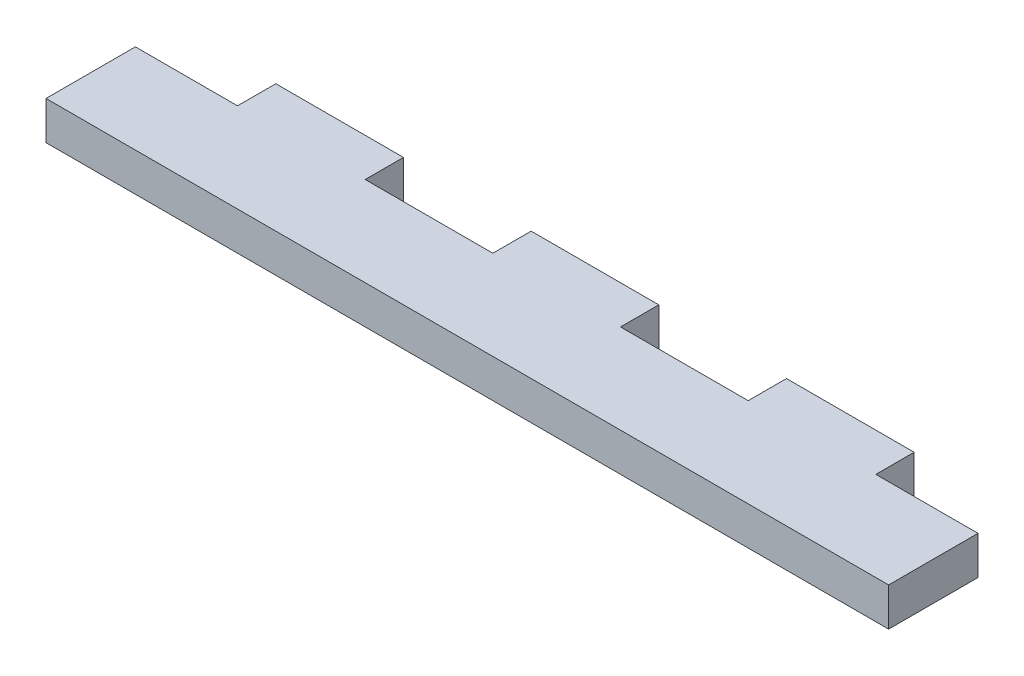
ISO-10303-21;
HEADER;
FILE_DESCRIPTION(('STEP AP214'),'2;1');
FILE_NAME('part.step','',(''),(''),'','','');
FILE_SCHEMA(('AUTOMOTIVE_DESIGN { 1 0 10303 214 1 1 1 1 }'));
ENDSEC;
DATA;
#1=APPLICATION_CONTEXT('core data for automotive mechanical design processes');
#2=APPLICATION_PROTOCOL_DEFINITION('international standard','automotive_design',2000,#1);
#3=PRODUCT_CONTEXT('',#1,'mechanical');
#4=PRODUCT('Part','Part','',(#3));
#5=PRODUCT_RELATED_PRODUCT_CATEGORY('part','',(#4));
#6=PRODUCT_DEFINITION_FORMATION('','',#4);
#7=PRODUCT_DEFINITION_CONTEXT('part definition',#1,'design');
#8=PRODUCT_DEFINITION('design','',#6,#7);
#9=PRODUCT_DEFINITION_SHAPE('','',#8);
#10=(LENGTH_UNIT() NAMED_UNIT(*) SI_UNIT(.MILLI.,.METRE.));
#11=(NAMED_UNIT(*) PLANE_ANGLE_UNIT() SI_UNIT($,.RADIAN.));
#12=(NAMED_UNIT(*) SI_UNIT($,.STERADIAN.) SOLID_ANGLE_UNIT());
#13=UNCERTAINTY_MEASURE_WITH_UNIT(LENGTH_MEASURE(1.E-05),#10,'distance_accuracy_value','');
#14=(GEOMETRIC_REPRESENTATION_CONTEXT(3) GLOBAL_UNCERTAINTY_ASSIGNED_CONTEXT((#13)) GLOBAL_UNIT_ASSIGNED_CONTEXT((#10,
#11,#12)) REPRESENTATION_CONTEXT('',''));
#15=CARTESIAN_POINT('',(0.,0.,0.));
#16=DIRECTION('',(0.,0.,1.));
#17=DIRECTION('',(1.,0.,0.));
#18=AXIS2_PLACEMENT_3D('',#15,#16,#17);
#19=CARTESIAN_POINT('',(-33.,3.,-5.));
#20=DIRECTION('',(0.,0.,1.));
#21=DIRECTION('',(1.,0.,0.));
#22=AXIS2_PLACEMENT_3D('',#19,#20,#21);
#23=PLANE('',#22);
#24=DIRECTION('',(-1.,0.,0.));
#25=VECTOR('',#24,1.);
#26=CARTESIAN_POINT('',(-33.,0.,-5.));
#27=LINE('',#26,#25);
#28=CARTESIAN_POINT('',(-15.,0.,-4.99999999999999));
#29=VERTEX_POINT('',#28);
#30=CARTESIAN_POINT('',(-25.,0.,-5.));
#31=VERTEX_POINT('',#30);
#32=EDGE_CURVE('E185',#29,#31,#27,.T.);
#33=ORIENTED_EDGE('',*,*,#32,.T.);
#34=DIRECTION('',(0.,1.,0.));
#35=VECTOR('',#34,1.);
#36=CARTESIAN_POINT('',(-25.,0.,-5.));
#37=LINE('',#36,#35);
#38=CARTESIAN_POINT('',(-25.,3.,-5.));
#39=VERTEX_POINT('',#38);
#40=EDGE_CURVE('E205',#31,#39,#37,.T.);
#41=ORIENTED_EDGE('',*,*,#40,.T.);
#42=DIRECTION('',(-1.,0.,0.));
#43=VECTOR('',#42,1.);
#44=CARTESIAN_POINT('',(-33.,3.,-5.));
#45=LINE('',#44,#43);
#46=CARTESIAN_POINT('',(-15.,3.,-4.99999999999999));
#47=VERTEX_POINT('',#46);
#48=EDGE_CURVE('E316',#47,#39,#45,.T.);
#49=ORIENTED_EDGE('',*,*,#48,.F.);
#50=DIRECTION('',(0.,1.,0.));
#51=VECTOR('',#50,1.);
#52=CARTESIAN_POINT('',(-15.,0.,-4.99999999999999));
#53=LINE('',#52,#51);
#54=EDGE_CURVE('E243',#29,#47,#53,.T.);
#55=ORIENTED_EDGE('',*,*,#54,.F.);
#56=EDGE_LOOP('',(#33,#41,#49,#55));
#57=FACE_BOUND('',#56,.T.);
#58=ADVANCED_FACE('F38',(#57),#23,.F.);
#59=CARTESIAN_POINT('',(25.,0.,-5.));
#60=VERTEX_POINT('',#59);
#61=CARTESIAN_POINT('',(15.,0.,-4.99999999999999));
#62=VERTEX_POINT('',#61);
#63=EDGE_CURVE('E176',#60,#62,#27,.T.);
#64=ORIENTED_EDGE('',*,*,#63,.T.);
#65=DIRECTION('',(0.,1.,0.));
#66=VECTOR('',#65,1.);
#67=CARTESIAN_POINT('',(15.,0.,-4.99999999999999));
#68=LINE('',#67,#66);
#69=CARTESIAN_POINT('',(15.,3.,-4.99999999999999));
#70=VERTEX_POINT('',#69);
#71=EDGE_CURVE('E237',#62,#70,#68,.T.);
#72=ORIENTED_EDGE('',*,*,#71,.T.);
#73=CARTESIAN_POINT('',(25.,3.,-5.));
#74=VERTEX_POINT('',#73);
#75=EDGE_CURVE('E200',#74,#70,#45,.T.);
#76=ORIENTED_EDGE('',*,*,#75,.F.);
#77=DIRECTION('',(0.,1.,0.));
#78=VECTOR('',#77,1.);
#79=CARTESIAN_POINT('',(25.,0.,-5.));
#80=LINE('',#79,#78);
#81=EDGE_CURVE('E301',#60,#74,#80,.T.);
#82=ORIENTED_EDGE('',*,*,#81,.F.);
#83=EDGE_LOOP('',(#64,#72,#76,#82));
#84=FACE_BOUND('',#83,.T.);
#85=ADVANCED_FACE('F333',(#84),#23,.F.);
#86=CARTESIAN_POINT('',(33.,3.,-5.));
#87=DIRECTION('',(-1.,0.,0.));
#88=DIRECTION('',(0.,0.,1.));
#89=AXIS2_PLACEMENT_3D('',#86,#87,#88);
#90=PLANE('',#89);
#91=DIRECTION('',(0.,0.,-1.));
#92=VECTOR('',#91,1.);
#93=CARTESIAN_POINT('',(33.,0.,-5.));
#94=LINE('',#93,#92);
#95=CARTESIAN_POINT('',(33.,0.,5.));
#96=VERTEX_POINT('',#95);
#97=CARTESIAN_POINT('',(33.,0.,-2.));
#98=VERTEX_POINT('',#97);
#99=EDGE_CURVE('E203',#96,#98,#94,.T.);
#100=ORIENTED_EDGE('',*,*,#99,.T.);
#101=DIRECTION('',(0.,1.,0.));
#102=VECTOR('',#101,1.);
#103=CARTESIAN_POINT('',(33.,0.,-2.));
#104=LINE('',#103,#102);
#105=CARTESIAN_POINT('',(33.,3.,-2.));
#106=VERTEX_POINT('',#105);
#107=EDGE_CURVE('E275',#98,#106,#104,.T.);
#108=ORIENTED_EDGE('',*,*,#107,.T.);
#109=DIRECTION('',(0.,0.,-1.));
#110=VECTOR('',#109,1.);
#111=CARTESIAN_POINT('',(33.,3.,-5.));
#112=LINE('',#111,#110);
#113=CARTESIAN_POINT('',(33.,3.,5.));
#114=VERTEX_POINT('',#113);
#115=EDGE_CURVE('E180',#114,#106,#112,.T.);
#116=ORIENTED_EDGE('',*,*,#115,.F.);
#117=DIRECTION('',(0.,-1.,0.));
#118=VECTOR('',#117,1.);
#119=CARTESIAN_POINT('',(33.,3.,5.));
#120=LINE('',#119,#118);
#121=EDGE_CURVE('E47',#114,#96,#120,.T.);
#122=ORIENTED_EDGE('',*,*,#121,.T.);
#123=EDGE_LOOP('',(#100,#108,#116,#122));
#124=FACE_BOUND('',#123,.T.);
#125=ADVANCED_FACE('F40',(#124),#90,.F.);
#126=CARTESIAN_POINT('',(5.00000000000002,0.,-4.99999999999999));
#127=VERTEX_POINT('',#126);
#128=CARTESIAN_POINT('',(-5.00000000000002,0.,-4.99999999999999));
#129=VERTEX_POINT('',#128);
#130=EDGE_CURVE('E183',#127,#129,#27,.T.);
#131=ORIENTED_EDGE('',*,*,#130,.T.);
#132=DIRECTION('',(0.,1.,0.));
#133=VECTOR('',#132,1.);
#134=CARTESIAN_POINT('',(-5.00000000000002,0.,-4.99999999999999));
#135=LINE('',#134,#133);
#136=CARTESIAN_POINT('',(-5.00000000000002,3.,-4.99999999999999));
#137=VERTEX_POINT('',#136);
#138=EDGE_CURVE('E247',#129,#137,#135,.T.);
#139=ORIENTED_EDGE('',*,*,#138,.T.);
#140=CARTESIAN_POINT('',(5.00000000000002,3.,-4.99999999999999));
#141=VERTEX_POINT('',#140);
#142=EDGE_CURVE('E318',#141,#137,#45,.T.);
#143=ORIENTED_EDGE('',*,*,#142,.F.);
#144=DIRECTION('',(0.,1.,0.));
#145=VECTOR('',#144,1.);
#146=CARTESIAN_POINT('',(5.00000000000002,0.,-4.99999999999999));
#147=LINE('',#146,#145);
#148=EDGE_CURVE('E269',#127,#141,#147,.T.);
#149=ORIENTED_EDGE('',*,*,#148,.F.);
#150=EDGE_LOOP('',(#131,#139,#143,#149));
#151=FACE_BOUND('',#150,.T.);
#152=ADVANCED_FACE('F350',(#151),#23,.F.);
#153=CARTESIAN_POINT('',(-33.,3.,-5.));
#154=DIRECTION('',(1.,0.,0.));
#155=DIRECTION('',(0.,0.,-1.));
#156=AXIS2_PLACEMENT_3D('',#153,#154,#155);
#157=PLANE('',#156);
#158=DIRECTION('',(0.,0.,1.));
#159=VECTOR('',#158,1.);
#160=CARTESIAN_POINT('',(-33.,3.,-5.));
#161=LINE('',#160,#159);
#162=CARTESIAN_POINT('',(-33.,3.,-2.));
#163=VERTEX_POINT('',#162);
#164=CARTESIAN_POINT('',(-33.,3.,5.));
#165=VERTEX_POINT('',#164);
#166=EDGE_CURVE('E168',#163,#165,#161,.T.);
#167=ORIENTED_EDGE('',*,*,#166,.F.);
#168=DIRECTION('',(0.,1.,0.));
#169=VECTOR('',#168,1.);
#170=CARTESIAN_POINT('',(-33.,0.,-2.));
#171=LINE('',#170,#169);
#172=CARTESIAN_POINT('',(-33.,0.,-2.));
#173=VERTEX_POINT('',#172);
#174=EDGE_CURVE('E155',#173,#163,#171,.T.);
#175=ORIENTED_EDGE('',*,*,#174,.F.);
#176=DIRECTION('',(0.,0.,1.));
#177=VECTOR('',#176,1.);
#178=CARTESIAN_POINT('',(-33.,0.,-5.));
#179=LINE('',#178,#177);
#180=CARTESIAN_POINT('',(-33.,0.,5.));
#181=VERTEX_POINT('',#180);
#182=EDGE_CURVE('E167',#173,#181,#179,.T.);
#183=ORIENTED_EDGE('',*,*,#182,.T.);
#184=DIRECTION('',(0.,-1.,0.));
#185=VECTOR('',#184,1.);
#186=CARTESIAN_POINT('',(-33.,3.,5.));
#187=LINE('',#186,#185);
#188=EDGE_CURVE('E11',#165,#181,#187,.T.);
#189=ORIENTED_EDGE('',*,*,#188,.F.);
#190=EDGE_LOOP('',(#167,#175,#183,#189));
#191=FACE_BOUND('',#190,.T.);
#192=ADVANCED_FACE('F165',(#191),#157,.F.);
#193=CARTESIAN_POINT('',(-33.,3.,5.));
#194=DIRECTION('',(0.,0.,-1.));
#195=DIRECTION('',(-1.,0.,0.));
#196=AXIS2_PLACEMENT_3D('',#193,#194,#195);
#197=PLANE('',#196);
#198=DIRECTION('',(1.,0.,0.));
#199=VECTOR('',#198,1.);
#200=CARTESIAN_POINT('',(-33.,0.,5.));
#201=LINE('',#200,#199);
#202=EDGE_CURVE('E174',#181,#96,#201,.T.);
#203=ORIENTED_EDGE('',*,*,#202,.T.);
#204=ORIENTED_EDGE('',*,*,#121,.F.);
#205=DIRECTION('',(1.,0.,0.));
#206=VECTOR('',#205,1.);
#207=CARTESIAN_POINT('',(-33.,3.,5.));
#208=LINE('',#207,#206);
#209=EDGE_CURVE('E189',#165,#114,#208,.T.);
#210=ORIENTED_EDGE('',*,*,#209,.F.);
#211=ORIENTED_EDGE('',*,*,#188,.T.);
#212=EDGE_LOOP('',(#203,#204,#210,#211));
#213=FACE_BOUND('',#212,.T.);
#214=ADVANCED_FACE('F365',(#213),#197,.F.);
#215=CARTESIAN_POINT('',(0.,3.,0.));
#216=DIRECTION('',(0.,1.,0.));
#217=DIRECTION('',(0.,0.,1.));
#218=AXIS2_PLACEMENT_3D('',#215,#216,#217);
#219=PLANE('',#218);
#220=DIRECTION('',(0.,0.,-1.));
#221=VECTOR('',#220,1.);
#222=CARTESIAN_POINT('',(-25.,3.,-5.));
#223=LINE('',#222,#221);
#224=CARTESIAN_POINT('',(-25.,3.,-2.));
#225=VERTEX_POINT('',#224);
#226=EDGE_CURVE('E161',#225,#39,#223,.T.);
#227=ORIENTED_EDGE('',*,*,#226,.F.);
#228=DIRECTION('',(1.,0.,0.));
#229=VECTOR('',#228,1.);
#230=CARTESIAN_POINT('',(-33.,3.,-2.));
#231=LINE('',#230,#229);
#232=EDGE_CURVE('E246',#163,#225,#231,.T.);
#233=ORIENTED_EDGE('',*,*,#232,.F.);
#234=ORIENTED_EDGE('',*,*,#166,.T.);
#235=ORIENTED_EDGE('',*,*,#209,.T.);
#236=ORIENTED_EDGE('',*,*,#115,.T.);
#237=DIRECTION('',(1.,0.,0.));
#238=VECTOR('',#237,1.);
#239=CARTESIAN_POINT('',(33.,3.,-2.));
#240=LINE('',#239,#238);
#241=CARTESIAN_POINT('',(25.,3.,-2.));
#242=VERTEX_POINT('',#241);
#243=EDGE_CURVE('E297',#242,#106,#240,.T.);
#244=ORIENTED_EDGE('',*,*,#243,.F.);
#245=DIRECTION('',(0.,0.,1.));
#246=VECTOR('',#245,1.);
#247=CARTESIAN_POINT('',(25.,3.,-5.));
#248=LINE('',#247,#246);
#249=EDGE_CURVE('E302',#74,#242,#248,.T.);
#250=ORIENTED_EDGE('',*,*,#249,.F.);
#251=ORIENTED_EDGE('',*,*,#75,.T.);
#252=DIRECTION('',(0.,0.,-1.));
#253=VECTOR('',#252,1.);
#254=CARTESIAN_POINT('',(15.,3.,-4.99999999999999));
#255=LINE('',#254,#253);
#256=CARTESIAN_POINT('',(15.,3.,-2.));
#257=VERTEX_POINT('',#256);
#258=EDGE_CURVE('E261',#257,#70,#255,.T.);
#259=ORIENTED_EDGE('',*,*,#258,.F.);
#260=DIRECTION('',(1.,0.,0.));
#261=VECTOR('',#260,1.);
#262=CARTESIAN_POINT('',(15.,3.,-2.));
#263=LINE('',#262,#261);
#264=CARTESIAN_POINT('',(5.00000000000002,3.,-2.));
#265=VERTEX_POINT('',#264);
#266=EDGE_CURVE('E274',#265,#257,#263,.T.);
#267=ORIENTED_EDGE('',*,*,#266,.F.);
#268=DIRECTION('',(0.,0.,1.));
#269=VECTOR('',#268,1.);
#270=CARTESIAN_POINT('',(5.00000000000002,3.,-4.99999999999999));
#271=LINE('',#270,#269);
#272=EDGE_CURVE('E270',#141,#265,#271,.T.);
#273=ORIENTED_EDGE('',*,*,#272,.F.);
#274=ORIENTED_EDGE('',*,*,#142,.T.);
#275=DIRECTION('',(0.,0.,-1.));
#276=VECTOR('',#275,1.);
#277=CARTESIAN_POINT('',(-5.00000000000002,3.,-4.99999999999999));
#278=LINE('',#277,#276);
#279=CARTESIAN_POINT('',(-5.00000000000002,3.,-2.));
#280=VERTEX_POINT('',#279);
#281=EDGE_CURVE('E225',#280,#137,#278,.T.);
#282=ORIENTED_EDGE('',*,*,#281,.F.);
#283=DIRECTION('',(1.,0.,0.));
#284=VECTOR('',#283,1.);
#285=CARTESIAN_POINT('',(-15.,3.,-2.));
#286=LINE('',#285,#284);
#287=CARTESIAN_POINT('',(-15.,3.,-2.));
#288=VERTEX_POINT('',#287);
#289=EDGE_CURVE('E236',#288,#280,#286,.T.);
#290=ORIENTED_EDGE('',*,*,#289,.F.);
#291=DIRECTION('',(0.,0.,1.));
#292=VECTOR('',#291,1.);
#293=CARTESIAN_POINT('',(-15.,3.,-4.99999999999999));
#294=LINE('',#293,#292);
#295=EDGE_CURVE('E232',#47,#288,#294,.T.);
#296=ORIENTED_EDGE('',*,*,#295,.F.);
#297=ORIENTED_EDGE('',*,*,#48,.T.);
#298=EDGE_LOOP('',(#227,#233,#234,#235,#236,#244,#250,#251,#259,#267,#273,#274,#282,#290,#296,#297));
#299=FACE_BOUND('',#298,.T.);
#300=ADVANCED_FACE('F328',(#299),#219,.T.);
#301=CARTESIAN_POINT('',(0.,0.,0.));
#302=DIRECTION('',(0.,1.,0.));
#303=DIRECTION('',(0.,0.,1.));
#304=AXIS2_PLACEMENT_3D('',#301,#302,#303);
#305=PLANE('',#304);
#306=DIRECTION('',(1.,0.,0.));
#307=VECTOR('',#306,1.);
#308=CARTESIAN_POINT('',(-33.,0.,-2.));
#309=LINE('',#308,#307);
#310=CARTESIAN_POINT('',(-25.,0.,-2.));
#311=VERTEX_POINT('',#310);
#312=EDGE_CURVE('E151',#173,#311,#309,.T.);
#313=ORIENTED_EDGE('',*,*,#312,.T.);
#314=DIRECTION('',(0.,0.,-1.));
#315=VECTOR('',#314,1.);
#316=CARTESIAN_POINT('',(-25.,0.,-5.));
#317=LINE('',#316,#315);
#318=EDGE_CURVE('E54',#311,#31,#317,.T.);
#319=ORIENTED_EDGE('',*,*,#318,.T.);
#320=ORIENTED_EDGE('',*,*,#32,.F.);
#321=DIRECTION('',(0.,0.,1.));
#322=VECTOR('',#321,1.);
#323=CARTESIAN_POINT('',(-15.,0.,-4.99999999999999));
#324=LINE('',#323,#322);
#325=CARTESIAN_POINT('',(-15.,0.,-2.));
#326=VERTEX_POINT('',#325);
#327=EDGE_CURVE('E220',#29,#326,#324,.T.);
#328=ORIENTED_EDGE('',*,*,#327,.T.);
#329=DIRECTION('',(1.,0.,0.));
#330=VECTOR('',#329,1.);
#331=CARTESIAN_POINT('',(-15.,0.,-2.));
#332=LINE('',#331,#330);
#333=CARTESIAN_POINT('',(-5.00000000000002,0.,-2.));
#334=VERTEX_POINT('',#333);
#335=EDGE_CURVE('E224',#326,#334,#332,.T.);
#336=ORIENTED_EDGE('',*,*,#335,.T.);
#337=DIRECTION('',(0.,0.,-1.));
#338=VECTOR('',#337,1.);
#339=CARTESIAN_POINT('',(-5.00000000000002,0.,-4.99999999999999));
#340=LINE('',#339,#338);
#341=EDGE_CURVE('E62',#334,#129,#340,.T.);
#342=ORIENTED_EDGE('',*,*,#341,.T.);
#343=ORIENTED_EDGE('',*,*,#130,.F.);
#344=DIRECTION('',(0.,0.,1.));
#345=VECTOR('',#344,1.);
#346=CARTESIAN_POINT('',(5.00000000000002,0.,-4.99999999999999));
#347=LINE('',#346,#345);
#348=CARTESIAN_POINT('',(5.00000000000002,0.,-2.));
#349=VERTEX_POINT('',#348);
#350=EDGE_CURVE('E256',#127,#349,#347,.T.);
#351=ORIENTED_EDGE('',*,*,#350,.T.);
#352=DIRECTION('',(1.,0.,0.));
#353=VECTOR('',#352,1.);
#354=CARTESIAN_POINT('',(15.,0.,-2.));
#355=LINE('',#354,#353);
#356=CARTESIAN_POINT('',(15.,0.,-2.));
#357=VERTEX_POINT('',#356);
#358=EDGE_CURVE('E260',#349,#357,#355,.T.);
#359=ORIENTED_EDGE('',*,*,#358,.T.);
#360=DIRECTION('',(0.,0.,-1.));
#361=VECTOR('',#360,1.);
#362=CARTESIAN_POINT('',(15.,0.,-4.99999999999999));
#363=LINE('',#362,#361);
#364=EDGE_CURVE('E265',#357,#62,#363,.T.);
#365=ORIENTED_EDGE('',*,*,#364,.T.);
#366=ORIENTED_EDGE('',*,*,#63,.F.);
#367=DIRECTION('',(0.,0.,1.));
#368=VECTOR('',#367,1.);
#369=CARTESIAN_POINT('',(25.,0.,-5.));
#370=LINE('',#369,#368);
#371=CARTESIAN_POINT('',(25.,0.,-2.));
#372=VERTEX_POINT('',#371);
#373=EDGE_CURVE('E292',#60,#372,#370,.T.);
#374=ORIENTED_EDGE('',*,*,#373,.T.);
#375=DIRECTION('',(1.,0.,0.));
#376=VECTOR('',#375,1.);
#377=CARTESIAN_POINT('',(33.,0.,-2.));
#378=LINE('',#377,#376);
#379=EDGE_CURVE('E296',#372,#98,#378,.T.);
#380=ORIENTED_EDGE('',*,*,#379,.T.);
#381=ORIENTED_EDGE('',*,*,#99,.F.);
#382=ORIENTED_EDGE('',*,*,#202,.F.);
#383=ORIENTED_EDGE('',*,*,#182,.F.);
#384=EDGE_LOOP('',(#313,#319,#320,#328,#336,#342,#343,#351,#359,#365,#366,#374,#380,#381,#382,#383));
#385=FACE_BOUND('',#384,.T.);
#386=ADVANCED_FACE('F172',(#385),#305,.F.);
#387=CARTESIAN_POINT('',(33.,0.,-2.));
#388=DIRECTION('',(0.,0.,1.));
#389=DIRECTION('',(1.,0.,0.));
#390=AXIS2_PLACEMENT_3D('',#387,#388,#389);
#391=PLANE('',#390);
#392=ORIENTED_EDGE('',*,*,#243,.T.);
#393=ORIENTED_EDGE('',*,*,#107,.F.);
#394=ORIENTED_EDGE('',*,*,#379,.F.);
#395=DIRECTION('',(0.,1.,0.));
#396=VECTOR('',#395,1.);
#397=CARTESIAN_POINT('',(25.,0.,-2.));
#398=LINE('',#397,#396);
#399=EDGE_CURVE('E310',#372,#242,#398,.T.);
#400=ORIENTED_EDGE('',*,*,#399,.T.);
#401=EDGE_LOOP('',(#392,#393,#394,#400));
#402=FACE_BOUND('',#401,.T.);
#403=ADVANCED_FACE('F367',(#402),#391,.F.);
#404=CARTESIAN_POINT('',(25.,0.,-5.));
#405=DIRECTION('',(-1.,0.,0.));
#406=DIRECTION('',(0.,0.,1.));
#407=AXIS2_PLACEMENT_3D('',#404,#405,#406);
#408=PLANE('',#407);
#409=ORIENTED_EDGE('',*,*,#249,.T.);
#410=ORIENTED_EDGE('',*,*,#399,.F.);
#411=ORIENTED_EDGE('',*,*,#373,.F.);
#412=ORIENTED_EDGE('',*,*,#81,.T.);
#413=EDGE_LOOP('',(#409,#410,#411,#412));
#414=FACE_BOUND('',#413,.T.);
#415=ADVANCED_FACE('F370',(#414),#408,.F.);
#416=CARTESIAN_POINT('',(15.,0.,-4.99999999999999));
#417=DIRECTION('',(1.,0.,0.));
#418=DIRECTION('',(0.,0.,-1.));
#419=AXIS2_PLACEMENT_3D('',#416,#417,#418);
#420=PLANE('',#419);
#421=ORIENTED_EDGE('',*,*,#258,.T.);
#422=ORIENTED_EDGE('',*,*,#71,.F.);
#423=ORIENTED_EDGE('',*,*,#364,.F.);
#424=DIRECTION('',(0.,1.,0.));
#425=VECTOR('',#424,1.);
#426=CARTESIAN_POINT('',(15.,0.,-2.));
#427=LINE('',#426,#425);
#428=EDGE_CURVE('E284',#357,#257,#427,.T.);
#429=ORIENTED_EDGE('',*,*,#428,.T.);
#430=EDGE_LOOP('',(#421,#422,#423,#429));
#431=FACE_BOUND('',#430,.T.);
#432=ADVANCED_FACE('F337',(#431),#420,.F.);
#433=CARTESIAN_POINT('',(15.,0.,-2.));
#434=DIRECTION('',(0.,0.,1.));
#435=DIRECTION('',(1.,0.,0.));
#436=AXIS2_PLACEMENT_3D('',#433,#434,#435);
#437=PLANE('',#436);
#438=ORIENTED_EDGE('',*,*,#266,.T.);
#439=ORIENTED_EDGE('',*,*,#428,.F.);
#440=ORIENTED_EDGE('',*,*,#358,.F.);
#441=DIRECTION('',(0.,1.,0.));
#442=VECTOR('',#441,1.);
#443=CARTESIAN_POINT('',(5.00000000000002,0.,-2.));
#444=LINE('',#443,#442);
#445=EDGE_CURVE('E287',#349,#265,#444,.T.);
#446=ORIENTED_EDGE('',*,*,#445,.T.);
#447=EDGE_LOOP('',(#438,#439,#440,#446));
#448=FACE_BOUND('',#447,.T.);
#449=ADVANCED_FACE('F341',(#448),#437,.F.);
#450=CARTESIAN_POINT('',(5.00000000000002,0.,-4.99999999999999));
#451=DIRECTION('',(-1.,0.,0.));
#452=DIRECTION('',(0.,0.,1.));
#453=AXIS2_PLACEMENT_3D('',#450,#451,#452);
#454=PLANE('',#453);
#455=ORIENTED_EDGE('',*,*,#272,.T.);
#456=ORIENTED_EDGE('',*,*,#445,.F.);
#457=ORIENTED_EDGE('',*,*,#350,.F.);
#458=ORIENTED_EDGE('',*,*,#148,.T.);
#459=EDGE_LOOP('',(#455,#456,#457,#458));
#460=FACE_BOUND('',#459,.T.);
#461=ADVANCED_FACE('F343',(#460),#454,.F.);
#462=CARTESIAN_POINT('',(-15.,0.,-4.99999999999999));
#463=DIRECTION('',(-1.,0.,0.));
#464=DIRECTION('',(0.,0.,1.));
#465=AXIS2_PLACEMENT_3D('',#462,#463,#464);
#466=PLANE('',#465);
#467=ORIENTED_EDGE('',*,*,#295,.T.);
#468=DIRECTION('',(0.,1.,0.));
#469=VECTOR('',#468,1.);
#470=CARTESIAN_POINT('',(-15.,0.,-2.));
#471=LINE('',#470,#469);
#472=EDGE_CURVE('E231',#326,#288,#471,.T.);
#473=ORIENTED_EDGE('',*,*,#472,.F.);
#474=ORIENTED_EDGE('',*,*,#327,.F.);
#475=ORIENTED_EDGE('',*,*,#54,.T.);
#476=EDGE_LOOP('',(#467,#473,#474,#475));
#477=FACE_BOUND('',#476,.T.);
#478=ADVANCED_FACE('F438',(#477),#466,.F.);
#479=CARTESIAN_POINT('',(-5.00000000000002,0.,-4.99999999999999));
#480=DIRECTION('',(1.,0.,0.));
#481=DIRECTION('',(0.,0.,-1.));
#482=AXIS2_PLACEMENT_3D('',#479,#480,#481);
#483=PLANE('',#482);
#484=ORIENTED_EDGE('',*,*,#281,.T.);
#485=ORIENTED_EDGE('',*,*,#138,.F.);
#486=ORIENTED_EDGE('',*,*,#341,.F.);
#487=DIRECTION('',(0.,1.,0.));
#488=VECTOR('',#487,1.);
#489=CARTESIAN_POINT('',(-5.00000000000002,0.,-2.));
#490=LINE('',#489,#488);
#491=EDGE_CURVE('E251',#334,#280,#490,.T.);
#492=ORIENTED_EDGE('',*,*,#491,.T.);
#493=EDGE_LOOP('',(#484,#485,#486,#492));
#494=FACE_BOUND('',#493,.T.);
#495=ADVANCED_FACE('F351',(#494),#483,.F.);
#496=CARTESIAN_POINT('',(-15.,0.,-2.));
#497=DIRECTION('',(0.,0.,1.));
#498=DIRECTION('',(1.,0.,0.));
#499=AXIS2_PLACEMENT_3D('',#496,#497,#498);
#500=PLANE('',#499);
#501=ORIENTED_EDGE('',*,*,#289,.T.);
#502=ORIENTED_EDGE('',*,*,#491,.F.);
#503=ORIENTED_EDGE('',*,*,#335,.F.);
#504=ORIENTED_EDGE('',*,*,#472,.T.);
#505=EDGE_LOOP('',(#501,#502,#503,#504));
#506=FACE_BOUND('',#505,.T.);
#507=ADVANCED_FACE('F355',(#506),#500,.F.);
#508=CARTESIAN_POINT('',(-25.,0.,-5.));
#509=DIRECTION('',(1.,0.,0.));
#510=DIRECTION('',(0.,0.,-1.));
#511=AXIS2_PLACEMENT_3D('',#508,#509,#510);
#512=PLANE('',#511);
#513=ORIENTED_EDGE('',*,*,#226,.T.);
#514=ORIENTED_EDGE('',*,*,#40,.F.);
#515=ORIENTED_EDGE('',*,*,#318,.F.);
#516=DIRECTION('',(0.,1.,0.));
#517=VECTOR('',#516,1.);
#518=CARTESIAN_POINT('',(-25.,0.,-2.));
#519=LINE('',#518,#517);
#520=EDGE_CURVE('E157',#311,#225,#519,.T.);
#521=ORIENTED_EDGE('',*,*,#520,.T.);
#522=EDGE_LOOP('',(#513,#514,#515,#521));
#523=FACE_BOUND('',#522,.T.);
#524=ADVANCED_FACE('F363',(#523),#512,.F.);
#525=CARTESIAN_POINT('',(-33.,0.,-2.));
#526=DIRECTION('',(0.,0.,1.));
#527=DIRECTION('',(1.,0.,0.));
#528=AXIS2_PLACEMENT_3D('',#525,#526,#527);
#529=PLANE('',#528);
#530=ORIENTED_EDGE('',*,*,#232,.T.);
#531=ORIENTED_EDGE('',*,*,#520,.F.);
#532=ORIENTED_EDGE('',*,*,#312,.F.);
#533=ORIENTED_EDGE('',*,*,#174,.T.);
#534=EDGE_LOOP('',(#530,#531,#532,#533));
#535=FACE_BOUND('',#534,.T.);
#536=ADVANCED_FACE('F154',(#535),#529,.F.);
#537=CLOSED_SHELL('',(#58,#85,#125,#152,#192,#214,#300,#386,#403,#415,#432,#449,#461,#478,#495,
#507,#524,#536));
#538=MANIFOLD_SOLID_BREP('B2',#537);
#539=ADVANCED_BREP_SHAPE_REPRESENTATION('',(#18,#538),#14);
#540=SHAPE_DEFINITION_REPRESENTATION(#9,#539);
ENDSEC;
END-ISO-10303-21;
